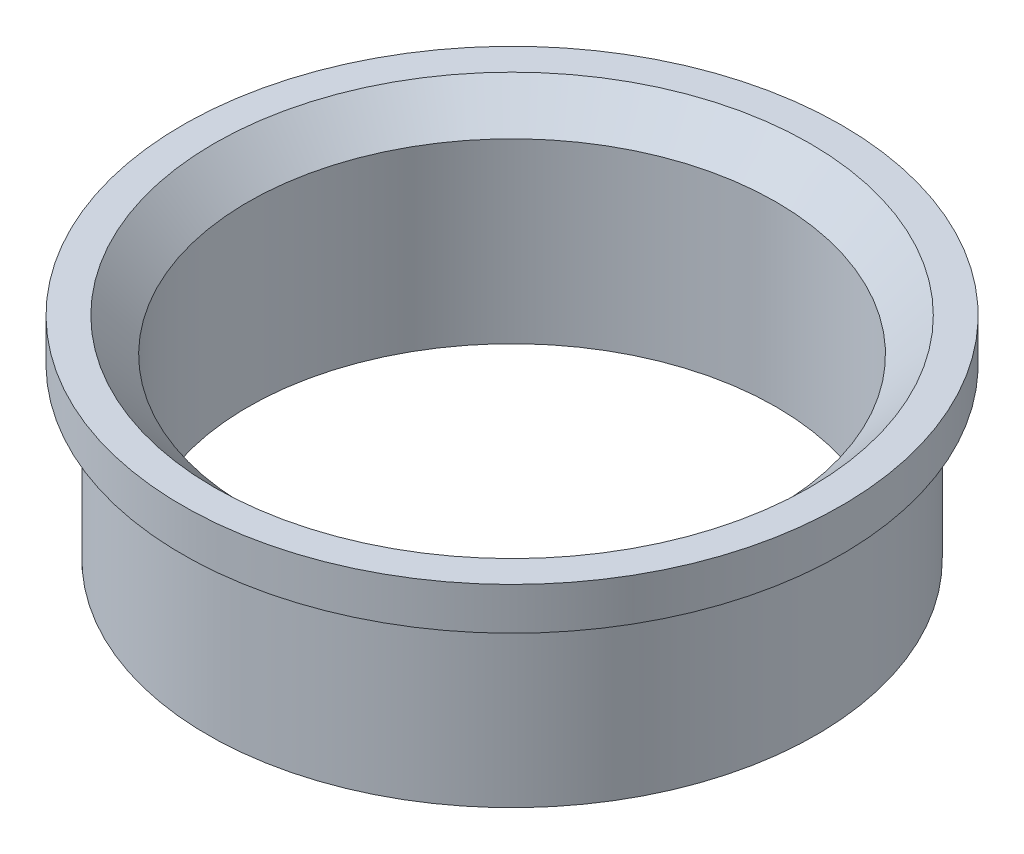
ISO-10303-21;
HEADER;
FILE_DESCRIPTION(('STEP AP214'),'2;1');
FILE_NAME('part.step','',(''),(''),'','','');
FILE_SCHEMA(('AUTOMOTIVE_DESIGN { 1 0 10303 214 1 1 1 1 }'));
ENDSEC;
DATA;
#1=APPLICATION_CONTEXT('core data for automotive mechanical design processes');
#2=APPLICATION_PROTOCOL_DEFINITION('international standard','automotive_design',2000,#1);
#3=PRODUCT_CONTEXT('',#1,'mechanical');
#4=PRODUCT('Part','Part','',(#3));
#5=PRODUCT_RELATED_PRODUCT_CATEGORY('part','',(#4));
#6=PRODUCT_DEFINITION_FORMATION('','',#4);
#7=PRODUCT_DEFINITION_CONTEXT('part definition',#1,'design');
#8=PRODUCT_DEFINITION('design','',#6,#7);
#9=PRODUCT_DEFINITION_SHAPE('','',#8);
#10=(LENGTH_UNIT() NAMED_UNIT(*) SI_UNIT(.MILLI.,.METRE.));
#11=(NAMED_UNIT(*) PLANE_ANGLE_UNIT() SI_UNIT($,.RADIAN.));
#12=(NAMED_UNIT(*) SI_UNIT($,.STERADIAN.) SOLID_ANGLE_UNIT());
#13=UNCERTAINTY_MEASURE_WITH_UNIT(LENGTH_MEASURE(1.E-05),#10,'distance_accuracy_value','');
#14=(GEOMETRIC_REPRESENTATION_CONTEXT(3) GLOBAL_UNCERTAINTY_ASSIGNED_CONTEXT((#13)) GLOBAL_UNIT_ASSIGNED_CONTEXT((#10,
#11,#12)) REPRESENTATION_CONTEXT('',''));
#15=CARTESIAN_POINT('',(0.,0.,0.));
#16=DIRECTION('',(0.,0.,1.));
#17=DIRECTION('',(1.,0.,0.));
#18=AXIS2_PLACEMENT_3D('',#15,#16,#17);
#19=CARTESIAN_POINT('',(62.5,0.,0.));
#20=DIRECTION('',(0.,-1.,0.));
#21=DIRECTION('',(0.,0.,-1.));
#22=AXIS2_PLACEMENT_3D('',#19,#20,#21);
#23=PLANE('',#22);
#24=CARTESIAN_POINT('',(0.,0.,0.));
#25=DIRECTION('',(0.,-1.,0.));
#26=DIRECTION('',(0.,0.,-1.));
#27=AXIS2_PLACEMENT_3D('',#24,#25,#26);
#28=CIRCLE('',#27,72.);
#29=CARTESIAN_POINT('',(0.,0.,-72.));
#30=VERTEX_POINT('',#29);
#31=EDGE_CURVE('E10',#30,#30,#28,.T.);
#32=ORIENTED_EDGE('',*,*,#31,.T.);
#33=EDGE_LOOP('',(#32));
#34=FACE_BOUND('',#33,.T.);
#35=CARTESIAN_POINT('',(0.,0.,0.));
#36=DIRECTION('',(0.,-1.,0.));
#37=DIRECTION('',(0.,0.,-1.));
#38=AXIS2_PLACEMENT_3D('',#35,#36,#37);
#39=CIRCLE('',#38,62.5);
#40=CARTESIAN_POINT('',(0.,0.,-62.5));
#41=VERTEX_POINT('',#40);
#42=EDGE_CURVE('E72',#41,#41,#39,.T.);
#43=ORIENTED_EDGE('',*,*,#42,.F.);
#44=EDGE_LOOP('',(#43));
#45=FACE_BOUND('',#44,.T.);
#46=ADVANCED_FACE('F41',(#34,#45),#23,.T.);
#47=CARTESIAN_POINT('',(0.,0.,0.));
#48=DIRECTION('',(0.,-1.,0.));
#49=DIRECTION('',(0.,0.,-1.));
#50=AXIS2_PLACEMENT_3D('',#47,#48,#49);
#51=CYLINDRICAL_SURFACE('',#50,72.);
#52=CARTESIAN_POINT('',(0.,40.,0.));
#53=DIRECTION('',(0.,-1.,0.));
#54=DIRECTION('',(0.,0.,-1.));
#55=AXIS2_PLACEMENT_3D('',#52,#53,#54);
#56=CIRCLE('',#55,72.);
#57=CARTESIAN_POINT('',(0.,40.,-72.));
#58=VERTEX_POINT('',#57);
#59=EDGE_CURVE('E48',#58,#58,#56,.T.);
#60=ORIENTED_EDGE('',*,*,#59,.T.);
#61=EDGE_LOOP('',(#60));
#62=FACE_BOUND('',#61,.T.);
#63=ORIENTED_EDGE('',*,*,#31,.F.);
#64=EDGE_LOOP('',(#63));
#65=FACE_BOUND('',#64,.T.);
#66=ADVANCED_FACE('F81',(#62,#65),#51,.T.);
#67=CARTESIAN_POINT('',(72.,40.,0.));
#68=DIRECTION('',(0.,-1.,0.));
#69=DIRECTION('',(0.,0.,-1.));
#70=AXIS2_PLACEMENT_3D('',#67,#68,#69);
#71=PLANE('',#70);
#72=CARTESIAN_POINT('',(0.,40.,0.));
#73=DIRECTION('',(0.,-1.,0.));
#74=DIRECTION('',(0.,0.,-1.));
#75=AXIS2_PLACEMENT_3D('',#72,#73,#74);
#76=CIRCLE('',#75,78.);
#77=CARTESIAN_POINT('',(0.,40.,-78.));
#78=VERTEX_POINT('',#77);
#79=EDGE_CURVE('E53',#78,#78,#76,.T.);
#80=ORIENTED_EDGE('',*,*,#79,.T.);
#81=EDGE_LOOP('',(#80));
#82=FACE_BOUND('',#81,.T.);
#83=ORIENTED_EDGE('',*,*,#59,.F.);
#84=EDGE_LOOP('',(#83));
#85=FACE_BOUND('',#84,.T.);
#86=ADVANCED_FACE('F85',(#82,#85),#71,.T.);
#87=CARTESIAN_POINT('',(0.,0.,0.));
#88=DIRECTION('',(0.,-1.,0.));
#89=DIRECTION('',(0.,0.,-1.));
#90=AXIS2_PLACEMENT_3D('',#87,#88,#89);
#91=CYLINDRICAL_SURFACE('',#90,78.);
#92=CARTESIAN_POINT('',(0.,50.,0.));
#93=DIRECTION('',(0.,-1.,0.));
#94=DIRECTION('',(0.,0.,-1.));
#95=AXIS2_PLACEMENT_3D('',#92,#93,#94);
#96=CIRCLE('',#95,78.);
#97=CARTESIAN_POINT('',(0.,50.,-78.));
#98=VERTEX_POINT('',#97);
#99=EDGE_CURVE('E58',#98,#98,#96,.T.);
#100=ORIENTED_EDGE('',*,*,#99,.T.);
#101=EDGE_LOOP('',(#100));
#102=FACE_BOUND('',#101,.T.);
#103=ORIENTED_EDGE('',*,*,#79,.F.);
#104=EDGE_LOOP('',(#103));
#105=FACE_BOUND('',#104,.T.);
#106=ADVANCED_FACE('F89',(#102,#105),#91,.T.);
#107=CARTESIAN_POINT('',(78.,50.,0.));
#108=DIRECTION('',(0.,1.,0.));
#109=DIRECTION('',(0.,0.,1.));
#110=AXIS2_PLACEMENT_3D('',#107,#108,#109);
#111=PLANE('',#110);
#112=CARTESIAN_POINT('',(0.,50.,0.));
#113=DIRECTION('',(0.,-1.,0.));
#114=DIRECTION('',(0.,0.,-1.));
#115=AXIS2_PLACEMENT_3D('',#112,#113,#114);
#116=CIRCLE('',#115,70.5);
#117=CARTESIAN_POINT('',(0.,50.,-70.5));
#118=VERTEX_POINT('',#117);
#119=EDGE_CURVE('E64',#118,#118,#116,.T.);
#120=ORIENTED_EDGE('',*,*,#119,.T.);
#121=EDGE_LOOP('',(#120));
#122=FACE_BOUND('',#121,.T.);
#123=ORIENTED_EDGE('',*,*,#99,.F.);
#124=EDGE_LOOP('',(#123));
#125=FACE_BOUND('',#124,.T.);
#126=ADVANCED_FACE('F96',(#122,#125),#111,.T.);
#127=CARTESIAN_POINT('',(0.,50.,0.));
#128=DIRECTION('',(0.,1.,0.));
#129=DIRECTION('',(0.,0.,1.));
#130=AXIS2_PLACEMENT_3D('',#127,#128,#129);
#131=CONICAL_SURFACE('',#130,70.5,0.785398163397449);
#132=CARTESIAN_POINT('',(0.,42.,0.));
#133=DIRECTION('',(0.,-1.,0.));
#134=DIRECTION('',(0.,0.,-1.));
#135=AXIS2_PLACEMENT_3D('',#132,#133,#134);
#136=CIRCLE('',#135,62.5);
#137=CARTESIAN_POINT('',(0.,42.,-62.5));
#138=VERTEX_POINT('',#137);
#139=EDGE_CURVE('E68',#138,#138,#136,.T.);
#140=ORIENTED_EDGE('',*,*,#139,.T.);
#141=EDGE_LOOP('',(#140));
#142=FACE_BOUND('',#141,.T.);
#143=ORIENTED_EDGE('',*,*,#119,.F.);
#144=EDGE_LOOP('',(#143));
#145=FACE_BOUND('',#144,.T.);
#146=ADVANCED_FACE('F100',(#142,#145),#131,.F.);
#147=CARTESIAN_POINT('',(0.,0.,0.));
#148=DIRECTION('',(0.,-1.,0.));
#149=DIRECTION('',(0.,0.,-1.));
#150=AXIS2_PLACEMENT_3D('',#147,#148,#149);
#151=CYLINDRICAL_SURFACE('',#150,62.5);
#152=ORIENTED_EDGE('',*,*,#42,.T.);
#153=EDGE_LOOP('',(#152));
#154=FACE_BOUND('',#153,.T.);
#155=ORIENTED_EDGE('',*,*,#139,.F.);
#156=EDGE_LOOP('',(#155));
#157=FACE_BOUND('',#156,.T.);
#158=ADVANCED_FACE('F77',(#154,#157),#151,.F.);
#159=CLOSED_SHELL('',(#46,#66,#86,#106,#126,#146,#158));
#160=MANIFOLD_SOLID_BREP('B2',#159);
#161=ADVANCED_BREP_SHAPE_REPRESENTATION('',(#18,#160),#14);
#162=SHAPE_DEFINITION_REPRESENTATION(#9,#161);
ENDSEC;
END-ISO-10303-21;
